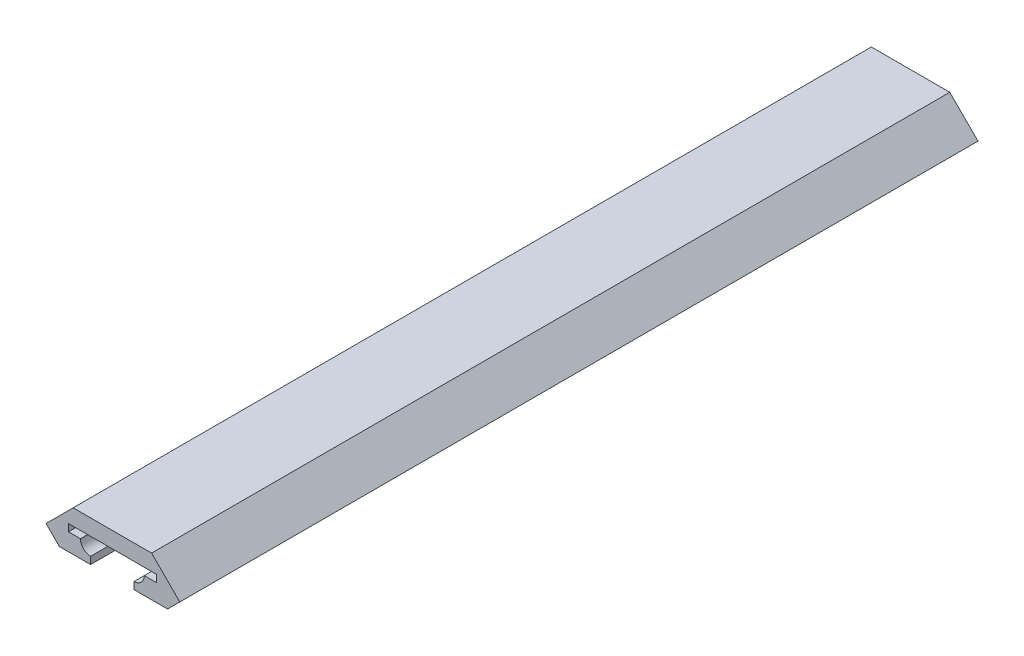
ISO-10303-21;
HEADER;
FILE_DESCRIPTION(('STEP AP214'),'2;1');
FILE_NAME('part.step','',(''),(''),'','','');
FILE_SCHEMA(('AUTOMOTIVE_DESIGN { 1 0 10303 214 1 1 1 1 }'));
ENDSEC;
DATA;
#1=APPLICATION_CONTEXT('core data for automotive mechanical design processes');
#2=APPLICATION_PROTOCOL_DEFINITION('international standard','automotive_design',2000,#1);
#3=PRODUCT_CONTEXT('',#1,'mechanical');
#4=PRODUCT('Part','Part','',(#3));
#5=PRODUCT_RELATED_PRODUCT_CATEGORY('part','',(#4));
#6=PRODUCT_DEFINITION_FORMATION('','',#4);
#7=PRODUCT_DEFINITION_CONTEXT('part definition',#1,'design');
#8=PRODUCT_DEFINITION('design','',#6,#7);
#9=PRODUCT_DEFINITION_SHAPE('','',#8);
#10=(LENGTH_UNIT() NAMED_UNIT(*) SI_UNIT(.MILLI.,.METRE.));
#11=(NAMED_UNIT(*) PLANE_ANGLE_UNIT() SI_UNIT($,.RADIAN.));
#12=(NAMED_UNIT(*) SI_UNIT($,.STERADIAN.) SOLID_ANGLE_UNIT());
#13=UNCERTAINTY_MEASURE_WITH_UNIT(LENGTH_MEASURE(1.E-05),#10,'distance_accuracy_value','');
#14=(GEOMETRIC_REPRESENTATION_CONTEXT(3) GLOBAL_UNCERTAINTY_ASSIGNED_CONTEXT((#13)) GLOBAL_UNIT_ASSIGNED_CONTEXT((#10,
#11,#12)) REPRESENTATION_CONTEXT('',''));
#15=CARTESIAN_POINT('',(0.,0.,0.));
#16=DIRECTION('',(0.,0.,1.));
#17=DIRECTION('',(1.,0.,0.));
#18=AXIS2_PLACEMENT_3D('',#15,#16,#17);
#19=CARTESIAN_POINT('',(0.,0.,100.));
#20=DIRECTION('',(-1.,0.,0.));
#21=DIRECTION('',(0.,-1.,0.));
#22=AXIS2_PLACEMENT_3D('',#19,#20,#21);
#23=PLANE('',#22);
#24=DIRECTION('',(0.,1.,0.));
#25=VECTOR('',#24,1.);
#26=CARTESIAN_POINT('',(0.,0.,0.));
#27=LINE('',#26,#25);
#28=CARTESIAN_POINT('',(0.,-0.9,0.));
#29=VERTEX_POINT('',#28);
#30=CARTESIAN_POINT('',(0.,0.,0.));
#31=VERTEX_POINT('',#30);
#32=EDGE_CURVE('E191',#29,#31,#27,.T.);
#33=ORIENTED_EDGE('',*,*,#32,.T.);
#34=DIRECTION('',(0.,0.,-1.));
#35=VECTOR('',#34,1.);
#36=CARTESIAN_POINT('',(0.,0.,100.));
#37=LINE('',#36,#35);
#38=CARTESIAN_POINT('',(0.,0.,100.));
#39=VERTEX_POINT('',#38);
#40=EDGE_CURVE('E11',#39,#31,#37,.T.);
#41=ORIENTED_EDGE('',*,*,#40,.F.);
#42=DIRECTION('',(0.,1.,0.));
#43=VECTOR('',#42,1.);
#44=CARTESIAN_POINT('',(0.,0.,100.));
#45=LINE('',#44,#43);
#46=CARTESIAN_POINT('',(0.,-0.9,100.));
#47=VERTEX_POINT('',#46);
#48=EDGE_CURVE('E238',#47,#39,#45,.T.);
#49=ORIENTED_EDGE('',*,*,#48,.F.);
#50=DIRECTION('',(0.,0.,-1.));
#51=VECTOR('',#50,1.);
#52=CARTESIAN_POINT('',(0.,-0.9,100.));
#53=LINE('',#52,#51);
#54=EDGE_CURVE('E189',#47,#29,#53,.T.);
#55=ORIENTED_EDGE('',*,*,#54,.T.);
#56=EDGE_LOOP('',(#33,#41,#49,#55));
#57=FACE_BOUND('',#56,.T.);
#58=ADVANCED_FACE('F44',(#57),#23,.F.);
#59=CARTESIAN_POINT('',(0.,0.,100.));
#60=DIRECTION('',(0.,1.,0.));
#61=DIRECTION('',(0.,0.,1.));
#62=AXIS2_PLACEMENT_3D('',#59,#60,#61);
#63=PLANE('',#62);
#64=DIRECTION('',(1.,0.,0.));
#65=VECTOR('',#64,1.);
#66=CARTESIAN_POINT('',(0.,0.,0.));
#67=LINE('',#66,#65);
#68=CARTESIAN_POINT('',(11.,0.,0.));
#69=VERTEX_POINT('',#68);
#70=EDGE_CURVE('E200',#31,#69,#67,.T.);
#71=ORIENTED_EDGE('',*,*,#70,.T.);
#72=DIRECTION('',(0.,0.,-1.));
#73=VECTOR('',#72,1.);
#74=CARTESIAN_POINT('',(11.,0.,100.));
#75=LINE('',#74,#73);
#76=CARTESIAN_POINT('',(11.,0.,100.));
#77=VERTEX_POINT('',#76);
#78=EDGE_CURVE('E53',#77,#69,#75,.T.);
#79=ORIENTED_EDGE('',*,*,#78,.F.);
#80=DIRECTION('',(1.,0.,0.));
#81=VECTOR('',#80,1.);
#82=CARTESIAN_POINT('',(0.,0.,100.));
#83=LINE('',#82,#81);
#84=EDGE_CURVE('E129',#39,#77,#83,.T.);
#85=ORIENTED_EDGE('',*,*,#84,.F.);
#86=ORIENTED_EDGE('',*,*,#40,.T.);
#87=EDGE_LOOP('',(#71,#79,#85,#86));
#88=FACE_BOUND('',#87,.T.);
#89=ADVANCED_FACE('F365',(#88),#63,.F.);
#90=CARTESIAN_POINT('',(11.,0.,100.));
#91=DIRECTION('',(1.,0.,0.));
#92=DIRECTION('',(0.,0.,-1.));
#93=AXIS2_PLACEMENT_3D('',#90,#91,#92);
#94=PLANE('',#93);
#95=DIRECTION('',(0.,-1.,0.));
#96=VECTOR('',#95,1.);
#97=CARTESIAN_POINT('',(11.,0.,0.));
#98=LINE('',#97,#96);
#99=CARTESIAN_POINT('',(11.,-0.9,0.));
#100=VERTEX_POINT('',#99);
#101=EDGE_CURVE('E202',#69,#100,#98,.T.);
#102=ORIENTED_EDGE('',*,*,#101,.T.);
#103=DIRECTION('',(0.,0.,-1.));
#104=VECTOR('',#103,1.);
#105=CARTESIAN_POINT('',(11.,-0.9,100.));
#106=LINE('',#105,#104);
#107=CARTESIAN_POINT('',(11.,-0.9,100.));
#108=VERTEX_POINT('',#107);
#109=EDGE_CURVE('E284',#108,#100,#106,.T.);
#110=ORIENTED_EDGE('',*,*,#109,.F.);
#111=DIRECTION('',(0.,-1.,0.));
#112=VECTOR('',#111,1.);
#113=CARTESIAN_POINT('',(11.,0.,100.));
#114=LINE('',#113,#112);
#115=EDGE_CURVE('E291',#77,#108,#114,.T.);
#116=ORIENTED_EDGE('',*,*,#115,.F.);
#117=ORIENTED_EDGE('',*,*,#78,.T.);
#118=EDGE_LOOP('',(#102,#110,#116,#117));
#119=FACE_BOUND('',#118,.T.);
#120=ADVANCED_FACE('F292',(#119),#94,.F.);
#121=CARTESIAN_POINT('',(11.,-0.9,100.));
#122=DIRECTION('',(0.,-1.,0.));
#123=DIRECTION('',(1.,0.,0.));
#124=AXIS2_PLACEMENT_3D('',#121,#122,#123);
#125=PLANE('',#124);
#126=DIRECTION('',(-1.,0.,0.));
#127=VECTOR('',#126,1.);
#128=CARTESIAN_POINT('',(11.,-0.9,0.));
#129=LINE('',#128,#127);
#130=CARTESIAN_POINT('',(9.5,-0.9,0.));
#131=VERTEX_POINT('',#130);
#132=EDGE_CURVE('E204',#100,#131,#129,.T.);
#133=ORIENTED_EDGE('',*,*,#132,.T.);
#134=DIRECTION('',(0.,0.,-1.));
#135=VECTOR('',#134,1.);
#136=CARTESIAN_POINT('',(9.5,-0.9,100.));
#137=LINE('',#136,#135);
#138=CARTESIAN_POINT('',(9.5,-0.9,100.));
#139=VERTEX_POINT('',#138);
#140=EDGE_CURVE('E278',#139,#131,#137,.T.);
#141=ORIENTED_EDGE('',*,*,#140,.F.);
#142=DIRECTION('',(-1.,0.,0.));
#143=VECTOR('',#142,1.);
#144=CARTESIAN_POINT('',(11.,-0.9,100.));
#145=LINE('',#144,#143);
#146=EDGE_CURVE('E315',#108,#139,#145,.T.);
#147=ORIENTED_EDGE('',*,*,#146,.F.);
#148=ORIENTED_EDGE('',*,*,#109,.T.);
#149=EDGE_LOOP('',(#133,#141,#147,#148));
#150=FACE_BOUND('',#149,.T.);
#151=ADVANCED_FACE('F302',(#150),#125,.F.);
#152=CARTESIAN_POINT('',(8.23,-0.9,100.));
#153=DIRECTION('',(0.,0.,-1.));
#154=DIRECTION('',(-1.,0.,0.));
#155=AXIS2_PLACEMENT_3D('',#152,#153,#154);
#156=CYLINDRICAL_SURFACE('',#155,1.27);
#157=CARTESIAN_POINT('',(8.23,-0.9,0.));
#158=DIRECTION('',(0.,0.,-1.));
#159=DIRECTION('',(-1.,0.,0.));
#160=AXIS2_PLACEMENT_3D('',#157,#158,#159);
#161=CIRCLE('',#160,1.27);
#162=CARTESIAN_POINT('',(8.23,-2.17,0.));
#163=VERTEX_POINT('',#162);
#164=EDGE_CURVE('E209',#131,#163,#161,.T.);
#165=ORIENTED_EDGE('',*,*,#164,.T.);
#166=DIRECTION('',(0.,0.,-1.));
#167=VECTOR('',#166,1.);
#168=CARTESIAN_POINT('',(8.23,-2.17,100.));
#169=LINE('',#168,#167);
#170=CARTESIAN_POINT('',(8.23,-2.17,100.));
#171=VERTEX_POINT('',#170);
#172=EDGE_CURVE('E274',#171,#163,#169,.T.);
#173=ORIENTED_EDGE('',*,*,#172,.F.);
#174=CARTESIAN_POINT('',(8.23,-0.9,100.));
#175=DIRECTION('',(0.,0.,-1.));
#176=DIRECTION('',(-1.,0.,0.));
#177=AXIS2_PLACEMENT_3D('',#174,#175,#176);
#178=CIRCLE('',#177,1.27);
#179=EDGE_CURVE('E306',#139,#171,#178,.T.);
#180=ORIENTED_EDGE('',*,*,#179,.F.);
#181=ORIENTED_EDGE('',*,*,#140,.T.);
#182=EDGE_LOOP('',(#165,#173,#180,#181));
#183=FACE_BOUND('',#182,.T.);
#184=ADVANCED_FACE('F308',(#183),#156,.F.);
#185=CARTESIAN_POINT('',(8.23,-2.17,100.));
#186=DIRECTION('',(1.,0.,0.));
#187=DIRECTION('',(0.,0.,-1.));
#188=AXIS2_PLACEMENT_3D('',#185,#186,#187);
#189=PLANE('',#188);
#190=DIRECTION('',(0.,-1.,0.));
#191=VECTOR('',#190,1.);
#192=CARTESIAN_POINT('',(8.23,-2.17,0.));
#193=LINE('',#192,#191);
#194=CARTESIAN_POINT('',(8.23,-3.07,0.));
#195=VERTEX_POINT('',#194);
#196=EDGE_CURVE('E208',#163,#195,#193,.T.);
#197=ORIENTED_EDGE('',*,*,#196,.T.);
#198=DIRECTION('',(0.,0.,-1.));
#199=VECTOR('',#198,1.);
#200=CARTESIAN_POINT('',(8.23,-3.07,100.));
#201=LINE('',#200,#199);
#202=CARTESIAN_POINT('',(8.23,-3.07,100.));
#203=VERTEX_POINT('',#202);
#204=EDGE_CURVE('E271',#203,#195,#201,.T.);
#205=ORIENTED_EDGE('',*,*,#204,.F.);
#206=DIRECTION('',(0.,-1.,0.));
#207=VECTOR('',#206,1.);
#208=CARTESIAN_POINT('',(8.23,-2.17,100.));
#209=LINE('',#208,#207);
#210=EDGE_CURVE('E311',#171,#203,#209,.T.);
#211=ORIENTED_EDGE('',*,*,#210,.F.);
#212=ORIENTED_EDGE('',*,*,#172,.T.);
#213=EDGE_LOOP('',(#197,#205,#211,#212));
#214=FACE_BOUND('',#213,.T.);
#215=ADVANCED_FACE('F373',(#214),#189,.F.);
#216=CARTESIAN_POINT('',(8.23,-3.07,100.));
#217=DIRECTION('',(0.,1.,0.));
#218=DIRECTION('',(0.,0.,1.));
#219=AXIS2_PLACEMENT_3D('',#216,#217,#218);
#220=PLANE('',#219);
#221=DIRECTION('',(1.,0.,0.));
#222=VECTOR('',#221,1.);
#223=CARTESIAN_POINT('',(8.23,-3.07,0.));
#224=LINE('',#223,#222);
#225=CARTESIAN_POINT('',(12.4152813742386,-3.07,0.));
#226=VERTEX_POINT('',#225);
#227=EDGE_CURVE('E211',#195,#226,#224,.T.);
#228=ORIENTED_EDGE('',*,*,#227,.T.);
#229=DIRECTION('',(0.,0.,-1.));
#230=VECTOR('',#229,1.);
#231=CARTESIAN_POINT('',(12.4152813742386,-3.07,100.));
#232=LINE('',#231,#230);
#233=CARTESIAN_POINT('',(12.4152813742386,-3.07,100.));
#234=VERTEX_POINT('',#233);
#235=EDGE_CURVE('E270',#234,#226,#232,.T.);
#236=ORIENTED_EDGE('',*,*,#235,.F.);
#237=DIRECTION('',(1.,0.,0.));
#238=VECTOR('',#237,1.);
#239=CARTESIAN_POINT('',(8.23,-3.07,100.));
#240=LINE('',#239,#238);
#241=EDGE_CURVE('E316',#203,#234,#240,.T.);
#242=ORIENTED_EDGE('',*,*,#241,.F.);
#243=ORIENTED_EDGE('',*,*,#204,.T.);
#244=EDGE_LOOP('',(#228,#236,#242,#243));
#245=FACE_BOUND('',#244,.T.);
#246=ADVANCED_FACE('F380',(#245),#220,.F.);
#247=CARTESIAN_POINT('',(12.4152813742386,-3.07,100.));
#248=DIRECTION('',(-0.707106781186544,0.707106781186551,0.));
#249=DIRECTION('',(-0.707106781186551,-0.707106781186544,0.));
#250=AXIS2_PLACEMENT_3D('',#247,#248,#249);
#251=PLANE('',#250);
#252=DIRECTION('',(0.707106781186551,0.707106781186544,0.));
#253=VECTOR('',#252,1.);
#254=CARTESIAN_POINT('',(12.4152813742386,-3.07,0.));
#255=LINE('',#254,#253);
#256=CARTESIAN_POINT('',(13.9497474683058,-1.53553390593275,0.));
#257=VERTEX_POINT('',#256);
#258=EDGE_CURVE('E218',#226,#257,#255,.T.);
#259=ORIENTED_EDGE('',*,*,#258,.T.);
#260=DIRECTION('',(0.,0.,-1.));
#261=VECTOR('',#260,1.);
#262=CARTESIAN_POINT('',(13.9497474683058,-1.53553390593275,100.));
#263=LINE('',#262,#261);
#264=CARTESIAN_POINT('',(13.9497474683058,-1.53553390593275,100.));
#265=VERTEX_POINT('',#264);
#266=EDGE_CURVE('E261',#265,#257,#263,.T.);
#267=ORIENTED_EDGE('',*,*,#266,.F.);
#268=DIRECTION('',(0.707106781186551,0.707106781186544,0.));
#269=VECTOR('',#268,1.);
#270=CARTESIAN_POINT('',(12.4152813742386,-3.07,100.));
#271=LINE('',#270,#269);
#272=EDGE_CURVE('E322',#234,#265,#271,.T.);
#273=ORIENTED_EDGE('',*,*,#272,.F.);
#274=ORIENTED_EDGE('',*,*,#235,.T.);
#275=EDGE_LOOP('',(#259,#267,#273,#274));
#276=FACE_BOUND('',#275,.T.);
#277=ADVANCED_FACE('F385',(#276),#251,.F.);
#278=CARTESIAN_POINT('',(13.9497474683058,-1.53553390593275,100.));
#279=DIRECTION('',(-0.707106781186551,-0.707106781186544,0.));
#280=DIRECTION('',(0.707106781186544,-0.707106781186551,0.));
#281=AXIS2_PLACEMENT_3D('',#278,#279,#280);
#282=PLANE('',#281);
#283=DIRECTION('',(-0.707106781186544,0.707106781186551,0.));
#284=VECTOR('',#283,1.);
#285=CARTESIAN_POINT('',(13.9497474683058,-1.53553390593275,0.));
#286=LINE('',#285,#284);
#287=CARTESIAN_POINT('',(10.4142135623731,2.,0.));
#288=VERTEX_POINT('',#287);
#289=EDGE_CURVE('E219',#257,#288,#286,.T.);
#290=ORIENTED_EDGE('',*,*,#289,.T.);
#291=DIRECTION('',(0.,0.,-1.));
#292=VECTOR('',#291,1.);
#293=CARTESIAN_POINT('',(10.4142135623731,2.,100.));
#294=LINE('',#293,#292);
#295=CARTESIAN_POINT('',(10.4142135623731,2.,100.));
#296=VERTEX_POINT('',#295);
#297=EDGE_CURVE('E260',#296,#288,#294,.T.);
#298=ORIENTED_EDGE('',*,*,#297,.F.);
#299=DIRECTION('',(-0.707106781186544,0.707106781186551,0.));
#300=VECTOR('',#299,1.);
#301=CARTESIAN_POINT('',(13.9497474683058,-1.53553390593275,100.));
#302=LINE('',#301,#300);
#303=EDGE_CURVE('E327',#265,#296,#302,.T.);
#304=ORIENTED_EDGE('',*,*,#303,.F.);
#305=ORIENTED_EDGE('',*,*,#266,.T.);
#306=EDGE_LOOP('',(#290,#298,#304,#305));
#307=FACE_BOUND('',#306,.T.);
#308=ADVANCED_FACE('F387',(#307),#282,.F.);
#309=CARTESIAN_POINT('',(10.4142135623731,2.,100.));
#310=DIRECTION('',(0.,-1.,0.));
#311=DIRECTION('',(1.,0.,0.));
#312=AXIS2_PLACEMENT_3D('',#309,#310,#311);
#313=PLANE('',#312);
#314=DIRECTION('',(-1.,0.,0.));
#315=VECTOR('',#314,1.);
#316=CARTESIAN_POINT('',(10.4142135623731,2.,0.));
#317=LINE('',#316,#315);
#318=CARTESIAN_POINT('',(0.585786437626891,2.,0.));
#319=VERTEX_POINT('',#318);
#320=EDGE_CURVE('E225',#288,#319,#317,.T.);
#321=ORIENTED_EDGE('',*,*,#320,.T.);
#322=DIRECTION('',(0.,0.,-1.));
#323=VECTOR('',#322,1.);
#324=CARTESIAN_POINT('',(0.585786437626891,2.,100.));
#325=LINE('',#324,#323);
#326=CARTESIAN_POINT('',(0.585786437626891,2.,100.));
#327=VERTEX_POINT('',#326);
#328=EDGE_CURVE('E253',#327,#319,#325,.T.);
#329=ORIENTED_EDGE('',*,*,#328,.F.);
#330=DIRECTION('',(-1.,0.,0.));
#331=VECTOR('',#330,1.);
#332=CARTESIAN_POINT('',(10.4142135623731,2.,100.));
#333=LINE('',#332,#331);
#334=EDGE_CURVE('E326',#296,#327,#333,.T.);
#335=ORIENTED_EDGE('',*,*,#334,.F.);
#336=ORIENTED_EDGE('',*,*,#297,.T.);
#337=EDGE_LOOP('',(#321,#329,#335,#336));
#338=FACE_BOUND('',#337,.T.);
#339=ADVANCED_FACE('F388',(#338),#313,.F.);
#340=CARTESIAN_POINT('',(0.585786437626891,2.,100.));
#341=DIRECTION('',(0.707106781186551,-0.707106781186544,0.));
#342=DIRECTION('',(0.707106781186544,0.707106781186551,0.));
#343=AXIS2_PLACEMENT_3D('',#340,#341,#342);
#344=PLANE('',#343);
#345=DIRECTION('',(-0.707106781186544,-0.707106781186551,0.));
#346=VECTOR('',#345,1.);
#347=CARTESIAN_POINT('',(0.585786437626891,2.,0.));
#348=LINE('',#347,#346);
#349=CARTESIAN_POINT('',(-2.81474746830583,-1.40053390593276,0.));
#350=VERTEX_POINT('',#349);
#351=EDGE_CURVE('E224',#319,#350,#348,.T.);
#352=ORIENTED_EDGE('',*,*,#351,.T.);
#353=DIRECTION('',(0.,0.,-1.));
#354=VECTOR('',#353,1.);
#355=CARTESIAN_POINT('',(-2.81474746830583,-1.40053390593276,100.));
#356=LINE('',#355,#354);
#357=CARTESIAN_POINT('',(-2.81474746830583,-1.40053390593276,100.));
#358=VERTEX_POINT('',#357);
#359=EDGE_CURVE('E252',#358,#350,#356,.T.);
#360=ORIENTED_EDGE('',*,*,#359,.F.);
#361=DIRECTION('',(-0.707106781186544,-0.707106781186551,0.));
#362=VECTOR('',#361,1.);
#363=CARTESIAN_POINT('',(0.585786437626891,2.,100.));
#364=LINE('',#363,#362);
#365=EDGE_CURVE('E334',#327,#358,#364,.T.);
#366=ORIENTED_EDGE('',*,*,#365,.F.);
#367=ORIENTED_EDGE('',*,*,#328,.T.);
#368=EDGE_LOOP('',(#352,#360,#366,#367));
#369=FACE_BOUND('',#368,.T.);
#370=ADVANCED_FACE('F395',(#369),#344,.F.);
#371=CARTESIAN_POINT('',(-2.81474746830583,-1.40053390593276,100.));
#372=DIRECTION('',(0.707106781186544,0.707106781186551,0.));
#373=DIRECTION('',(-0.707106781186551,0.707106781186544,0.));
#374=AXIS2_PLACEMENT_3D('',#371,#372,#373);
#375=PLANE('',#374);
#376=DIRECTION('',(0.707106781186551,-0.707106781186544,0.));
#377=VECTOR('',#376,1.);
#378=CARTESIAN_POINT('',(-2.81474746830583,-1.40053390593276,0.));
#379=LINE('',#378,#377);
#380=CARTESIAN_POINT('',(-1.14528137423857,-3.07,0.));
#381=VERTEX_POINT('',#380);
#382=EDGE_CURVE('E228',#350,#381,#379,.T.);
#383=ORIENTED_EDGE('',*,*,#382,.T.);
#384=DIRECTION('',(0.,0.,-1.));
#385=VECTOR('',#384,1.);
#386=CARTESIAN_POINT('',(-1.14528137423857,-3.07,100.));
#387=LINE('',#386,#385);
#388=CARTESIAN_POINT('',(-1.14528137423857,-3.07,100.));
#389=VERTEX_POINT('',#388);
#390=EDGE_CURVE('E250',#389,#381,#387,.T.);
#391=ORIENTED_EDGE('',*,*,#390,.F.);
#392=DIRECTION('',(0.707106781186551,-0.707106781186544,0.));
#393=VECTOR('',#392,1.);
#394=CARTESIAN_POINT('',(-2.81474746830583,-1.40053390593276,100.));
#395=LINE('',#394,#393);
#396=EDGE_CURVE('E333',#358,#389,#395,.T.);
#397=ORIENTED_EDGE('',*,*,#396,.F.);
#398=ORIENTED_EDGE('',*,*,#359,.T.);
#399=EDGE_LOOP('',(#383,#391,#397,#398));
#400=FACE_BOUND('',#399,.T.);
#401=ADVANCED_FACE('F345',(#400),#375,.F.);
#402=CARTESIAN_POINT('',(-1.14528137423857,-3.07,100.));
#403=DIRECTION('',(0.,1.,0.));
#404=DIRECTION('',(-1.,0.,0.));
#405=AXIS2_PLACEMENT_3D('',#402,#403,#404);
#406=PLANE('',#405);
#407=DIRECTION('',(1.,0.,0.));
#408=VECTOR('',#407,1.);
#409=CARTESIAN_POINT('',(-1.14528137423857,-3.07,0.));
#410=LINE('',#409,#408);
#411=CARTESIAN_POINT('',(2.77,-3.07,0.));
#412=VERTEX_POINT('',#411);
#413=EDGE_CURVE('E231',#381,#412,#410,.T.);
#414=ORIENTED_EDGE('',*,*,#413,.T.);
#415=DIRECTION('',(0.,0.,-1.));
#416=VECTOR('',#415,1.);
#417=CARTESIAN_POINT('',(2.77,-3.07,100.));
#418=LINE('',#417,#416);
#419=CARTESIAN_POINT('',(2.77,-3.07,100.));
#420=VERTEX_POINT('',#419);
#421=EDGE_CURVE('E183',#420,#412,#418,.T.);
#422=ORIENTED_EDGE('',*,*,#421,.F.);
#423=DIRECTION('',(1.,0.,0.));
#424=VECTOR('',#423,1.);
#425=CARTESIAN_POINT('',(-1.14528137423857,-3.07,100.));
#426=LINE('',#425,#424);
#427=EDGE_CURVE('E175',#389,#420,#426,.T.);
#428=ORIENTED_EDGE('',*,*,#427,.F.);
#429=ORIENTED_EDGE('',*,*,#390,.T.);
#430=EDGE_LOOP('',(#414,#422,#428,#429));
#431=FACE_BOUND('',#430,.T.);
#432=ADVANCED_FACE('F347',(#431),#406,.F.);
#433=CARTESIAN_POINT('',(2.77,-2.17,100.));
#434=DIRECTION('',(-1.,0.,0.));
#435=DIRECTION('',(0.,0.,1.));
#436=AXIS2_PLACEMENT_3D('',#433,#434,#435);
#437=PLANE('',#436);
#438=DIRECTION('',(0.,1.,0.));
#439=VECTOR('',#438,1.);
#440=CARTESIAN_POINT('',(2.77,-2.17,0.));
#441=LINE('',#440,#439);
#442=CARTESIAN_POINT('',(2.77,-2.17,0.));
#443=VERTEX_POINT('',#442);
#444=EDGE_CURVE('E181',#412,#443,#441,.T.);
#445=ORIENTED_EDGE('',*,*,#444,.T.);
#446=DIRECTION('',(0.,0.,-1.));
#447=VECTOR('',#446,1.);
#448=CARTESIAN_POINT('',(2.77,-2.17,100.));
#449=LINE('',#448,#447);
#450=CARTESIAN_POINT('',(2.77,-2.17,100.));
#451=VERTEX_POINT('',#450);
#452=EDGE_CURVE('E178',#451,#443,#449,.T.);
#453=ORIENTED_EDGE('',*,*,#452,.F.);
#454=DIRECTION('',(0.,1.,0.));
#455=VECTOR('',#454,1.);
#456=CARTESIAN_POINT('',(2.77,-2.17,100.));
#457=LINE('',#456,#455);
#458=EDGE_CURVE('E168',#420,#451,#457,.T.);
#459=ORIENTED_EDGE('',*,*,#458,.F.);
#460=ORIENTED_EDGE('',*,*,#421,.T.);
#461=EDGE_LOOP('',(#445,#453,#459,#460));
#462=FACE_BOUND('',#461,.T.);
#463=ADVANCED_FACE('F177',(#462),#437,.F.);
#464=CARTESIAN_POINT('',(2.77,-0.899999999999999,100.));
#465=DIRECTION('',(0.,0.,-1.));
#466=DIRECTION('',(-1.,0.,0.));
#467=AXIS2_PLACEMENT_3D('',#464,#465,#466);
#468=CYLINDRICAL_SURFACE('',#467,1.27);
#469=CARTESIAN_POINT('',(2.77,-0.899999999999999,0.));
#470=DIRECTION('',(0.,0.,-1.));
#471=DIRECTION('',(1.,0.,0.));
#472=AXIS2_PLACEMENT_3D('',#469,#470,#471);
#473=CIRCLE('',#472,1.27);
#474=CARTESIAN_POINT('',(1.5,-0.9,0.));
#475=VERTEX_POINT('',#474);
#476=EDGE_CURVE('E113',#443,#475,#473,.T.);
#477=ORIENTED_EDGE('',*,*,#476,.T.);
#478=DIRECTION('',(0.,0.,-1.));
#479=VECTOR('',#478,1.);
#480=CARTESIAN_POINT('',(1.5,-0.9,100.));
#481=LINE('',#480,#479);
#482=CARTESIAN_POINT('',(1.5,-0.9,100.));
#483=VERTEX_POINT('',#482);
#484=EDGE_CURVE('E182',#483,#475,#481,.T.);
#485=ORIENTED_EDGE('',*,*,#484,.F.);
#486=CARTESIAN_POINT('',(2.77,-0.899999999999999,100.));
#487=DIRECTION('',(0.,0.,-1.));
#488=DIRECTION('',(1.,0.,0.));
#489=AXIS2_PLACEMENT_3D('',#486,#487,#488);
#490=CIRCLE('',#489,1.27);
#491=EDGE_CURVE('E169',#451,#483,#490,.T.);
#492=ORIENTED_EDGE('',*,*,#491,.F.);
#493=ORIENTED_EDGE('',*,*,#452,.T.);
#494=EDGE_LOOP('',(#477,#485,#492,#493));
#495=FACE_BOUND('',#494,.T.);
#496=ADVANCED_FACE('F186',(#495),#468,.F.);
#497=CARTESIAN_POINT('',(0.,-0.9,100.));
#498=DIRECTION('',(0.,-1.,0.));
#499=DIRECTION('',(0.,0.,-1.));
#500=AXIS2_PLACEMENT_3D('',#497,#498,#499);
#501=PLANE('',#500);
#502=DIRECTION('',(-1.,0.,0.));
#503=VECTOR('',#502,1.);
#504=CARTESIAN_POINT('',(0.,-0.9,0.));
#505=LINE('',#504,#503);
#506=EDGE_CURVE('E123',#475,#29,#505,.T.);
#507=ORIENTED_EDGE('',*,*,#506,.T.);
#508=ORIENTED_EDGE('',*,*,#54,.F.);
#509=DIRECTION('',(-1.,0.,0.));
#510=VECTOR('',#509,1.);
#511=CARTESIAN_POINT('',(0.,-0.9,100.));
#512=LINE('',#511,#510);
#513=EDGE_CURVE('E64',#483,#47,#512,.T.);
#514=ORIENTED_EDGE('',*,*,#513,.F.);
#515=ORIENTED_EDGE('',*,*,#484,.T.);
#516=EDGE_LOOP('',(#507,#508,#514,#515));
#517=FACE_BOUND('',#516,.T.);
#518=ADVANCED_FACE('F353',(#517),#501,.F.);
#519=CARTESIAN_POINT('',(2.77,-0.899999999999999,100.));
#520=DIRECTION('',(0.,0.,1.));
#521=DIRECTION('',(1.,0.,0.));
#522=AXIS2_PLACEMENT_3D('',#519,#520,#521);
#523=PLANE('',#522);
#524=ORIENTED_EDGE('',*,*,#48,.T.);
#525=ORIENTED_EDGE('',*,*,#84,.T.);
#526=ORIENTED_EDGE('',*,*,#115,.T.);
#527=ORIENTED_EDGE('',*,*,#146,.T.);
#528=ORIENTED_EDGE('',*,*,#179,.T.);
#529=ORIENTED_EDGE('',*,*,#210,.T.);
#530=ORIENTED_EDGE('',*,*,#241,.T.);
#531=ORIENTED_EDGE('',*,*,#272,.T.);
#532=ORIENTED_EDGE('',*,*,#303,.T.);
#533=ORIENTED_EDGE('',*,*,#334,.T.);
#534=ORIENTED_EDGE('',*,*,#365,.T.);
#535=ORIENTED_EDGE('',*,*,#396,.T.);
#536=ORIENTED_EDGE('',*,*,#427,.T.);
#537=ORIENTED_EDGE('',*,*,#458,.T.);
#538=ORIENTED_EDGE('',*,*,#491,.T.);
#539=ORIENTED_EDGE('',*,*,#513,.T.);
#540=EDGE_LOOP('',(#524,#525,#526,#527,#528,#529,#530,#531,#532,#533,#534,#535,#536,#537,#538,#539));
#541=FACE_BOUND('',#540,.T.);
#542=ADVANCED_FACE('F166',(#541),#523,.T.);
#543=CARTESIAN_POINT('',(2.77,-0.899999999999999,0.));
#544=DIRECTION('',(0.,0.,1.));
#545=DIRECTION('',(1.,0.,0.));
#546=AXIS2_PLACEMENT_3D('',#543,#544,#545);
#547=PLANE('',#546);
#548=ORIENTED_EDGE('',*,*,#32,.F.);
#549=ORIENTED_EDGE('',*,*,#506,.F.);
#550=ORIENTED_EDGE('',*,*,#476,.F.);
#551=ORIENTED_EDGE('',*,*,#444,.F.);
#552=ORIENTED_EDGE('',*,*,#413,.F.);
#553=ORIENTED_EDGE('',*,*,#382,.F.);
#554=ORIENTED_EDGE('',*,*,#351,.F.);
#555=ORIENTED_EDGE('',*,*,#320,.F.);
#556=ORIENTED_EDGE('',*,*,#289,.F.);
#557=ORIENTED_EDGE('',*,*,#258,.F.);
#558=ORIENTED_EDGE('',*,*,#227,.F.);
#559=ORIENTED_EDGE('',*,*,#196,.F.);
#560=ORIENTED_EDGE('',*,*,#164,.F.);
#561=ORIENTED_EDGE('',*,*,#132,.F.);
#562=ORIENTED_EDGE('',*,*,#101,.F.);
#563=ORIENTED_EDGE('',*,*,#70,.F.);
#564=EDGE_LOOP('',(#548,#549,#550,#551,#552,#553,#554,#555,#556,#557,#558,#559,#560,#561,#562,#563));
#565=FACE_BOUND('',#564,.T.);
#566=ADVANCED_FACE('F299',(#565),#547,.F.);
#567=CLOSED_SHELL('',(#58,#89,#120,#151,#184,#215,#246,#277,#308,#339,#370,#401,#432,#463,#496,
#518,#542,#566));
#568=MANIFOLD_SOLID_BREP('B2',#567);
#569=ADVANCED_BREP_SHAPE_REPRESENTATION('',(#18,#568),#14);
#570=SHAPE_DEFINITION_REPRESENTATION(#9,#569);
ENDSEC;
END-ISO-10303-21;
